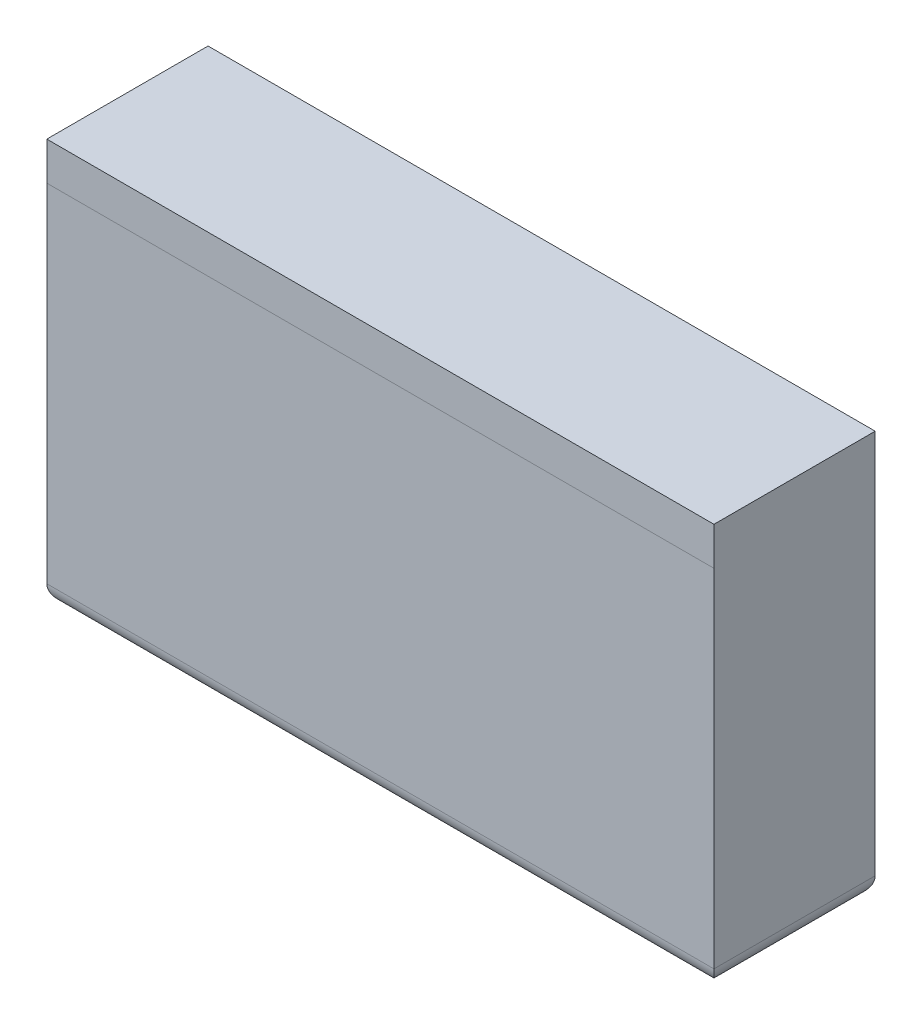
ISO-10303-21;
HEADER;
FILE_DESCRIPTION(('STEP AP214'),'2;1');
FILE_NAME('part.step','',(''),(''),'','','');
FILE_SCHEMA(('AUTOMOTIVE_DESIGN { 1 0 10303 214 1 1 1 1 }'));
ENDSEC;
DATA;
#1=APPLICATION_CONTEXT('core data for automotive mechanical design processes');
#2=APPLICATION_PROTOCOL_DEFINITION('international standard','automotive_design',2000,#1);
#3=PRODUCT_CONTEXT('',#1,'mechanical');
#4=PRODUCT('Part','Part','',(#3));
#5=PRODUCT_RELATED_PRODUCT_CATEGORY('part','',(#4));
#6=PRODUCT_DEFINITION_FORMATION('','',#4);
#7=PRODUCT_DEFINITION_CONTEXT('part definition',#1,'design');
#8=PRODUCT_DEFINITION('design','',#6,#7);
#9=PRODUCT_DEFINITION_SHAPE('','',#8);
#10=(LENGTH_UNIT() NAMED_UNIT(*) SI_UNIT(.MILLI.,.METRE.));
#11=(NAMED_UNIT(*) PLANE_ANGLE_UNIT() SI_UNIT($,.RADIAN.));
#12=(NAMED_UNIT(*) SI_UNIT($,.STERADIAN.) SOLID_ANGLE_UNIT());
#13=UNCERTAINTY_MEASURE_WITH_UNIT(LENGTH_MEASURE(1.E-05),#10,'distance_accuracy_value','');
#14=(GEOMETRIC_REPRESENTATION_CONTEXT(3) GLOBAL_UNCERTAINTY_ASSIGNED_CONTEXT((#13)) GLOBAL_UNIT_ASSIGNED_CONTEXT((#10,
#11,#12)) REPRESENTATION_CONTEXT('',''));
#15=CARTESIAN_POINT('',(0.,0.,0.));
#16=DIRECTION('',(0.,0.,1.));
#17=DIRECTION('',(1.,0.,0.));
#18=AXIS2_PLACEMENT_3D('',#15,#16,#17);
#19=CARTESIAN_POINT('',(122.822931560593,4.,0.));
#20=DIRECTION('',(-1.,0.,0.));
#21=DIRECTION('',(0.,0.,1.));
#22=AXIS2_PLACEMENT_3D('',#19,#20,#21);
#23=PLANE('',#22);
#24=DIRECTION('',(0.,-1.,0.));
#25=VECTOR('',#24,1.);
#26=CARTESIAN_POINT('',(122.822931560593,4.,21.15));
#27=LINE('',#26,#25);
#28=CARTESIAN_POINT('',(122.822931560593,96.,21.1493274629521));
#29=VERTEX_POINT('',#28);
#30=CARTESIAN_POINT('',(122.822931560593,5.,21.15));
#31=VERTEX_POINT('',#30);
#32=EDGE_CURVE('E328',#29,#31,#27,.T.);
#33=ORIENTED_EDGE('',*,*,#32,.T.);
#34=DIRECTION('',(0.,0.,-1.));
#35=VECTOR('',#34,1.);
#36=CARTESIAN_POINT('',(122.822931560593,5.,0.));
#37=LINE('',#36,#35);
#38=CARTESIAN_POINT('',(122.822931560593,5.,-21.15));
#39=VERTEX_POINT('',#38);
#40=EDGE_CURVE('E12',#31,#39,#37,.T.);
#41=ORIENTED_EDGE('',*,*,#40,.T.);
#42=DIRECTION('',(0.,-1.,0.));
#43=VECTOR('',#42,1.);
#44=CARTESIAN_POINT('',(122.822931560593,4.,-21.15));
#45=LINE('',#44,#43);
#46=CARTESIAN_POINT('',(122.822931560593,96.,-21.1493274629521));
#47=VERTEX_POINT('',#46);
#48=EDGE_CURVE('E175',#47,#39,#45,.T.);
#49=ORIENTED_EDGE('',*,*,#48,.F.);
#50=DIRECTION('',(0.,-1.,0.));
#51=VECTOR('',#50,1.);
#52=CARTESIAN_POINT('',(122.822931560593,106.,-21.1486549259042));
#53=LINE('',#52,#51);
#54=CARTESIAN_POINT('',(122.822931560593,106.,-21.1486549259042));
#55=VERTEX_POINT('',#54);
#56=EDGE_CURVE('E170',#55,#47,#53,.T.);
#57=ORIENTED_EDGE('',*,*,#56,.F.);
#58=DIRECTION('',(0.,0.,1.));
#59=VECTOR('',#58,1.);
#60=CARTESIAN_POINT('',(122.822931560593,106.,-21.1486549259042));
#61=LINE('',#60,#59);
#62=CARTESIAN_POINT('',(122.822931560593,106.,21.1486549259042));
#63=VERTEX_POINT('',#62);
#64=EDGE_CURVE('E173',#55,#63,#61,.T.);
#65=ORIENTED_EDGE('',*,*,#64,.T.);
#66=DIRECTION('',(0.,-1.,0.));
#67=VECTOR('',#66,1.);
#68=CARTESIAN_POINT('',(122.822931560593,106.,21.1486549259042));
#69=LINE('',#68,#67);
#70=EDGE_CURVE('E179',#63,#29,#69,.T.);
#71=ORIENTED_EDGE('',*,*,#70,.T.);
#72=EDGE_LOOP('',(#33,#41,#49,#57,#65,#71));
#73=FACE_BOUND('',#72,.T.);
#74=ADVANCED_FACE('F54',(#73),#23,.F.);
#75=CARTESIAN_POINT('',(0.,4.,-21.15));
#76=DIRECTION('',(0.,0.,-1.));
#77=DIRECTION('',(-1.,0.,0.));
#78=AXIS2_PLACEMENT_3D('',#75,#76,#77);
#79=PLANE('',#78);
#80=DIRECTION('',(0.,-1.,0.));
#81=VECTOR('',#80,1.);
#82=CARTESIAN_POINT('',(74.6879315605929,16.03,-21.15));
#83=LINE('',#82,#81);
#84=CARTESIAN_POINT('',(74.6879315605929,16.03,-21.15));
#85=VERTEX_POINT('',#84);
#86=CARTESIAN_POINT('',(74.6879315605929,5.,-21.15));
#87=VERTEX_POINT('',#86);
#88=EDGE_CURVE('E81',#85,#87,#83,.T.);
#89=ORIENTED_EDGE('',*,*,#88,.F.);
#90=DIRECTION('',(1.,0.,0.));
#91=VECTOR('',#90,1.);
#92=CARTESIAN_POINT('',(-4.04206843940716,16.03,-21.15));
#93=LINE('',#92,#91);
#94=CARTESIAN_POINT('',(-4.04206843940716,16.03,-21.15));
#95=VERTEX_POINT('',#94);
#96=EDGE_CURVE('E276',#95,#85,#93,.T.);
#97=ORIENTED_EDGE('',*,*,#96,.F.);
#98=DIRECTION('',(0.,1.,0.));
#99=VECTOR('',#98,1.);
#100=CARTESIAN_POINT('',(-4.04206843940716,16.03,-21.15));
#101=LINE('',#100,#99);
#102=CARTESIAN_POINT('',(-4.04206843940716,5.,-21.15));
#103=VERTEX_POINT('',#102);
#104=EDGE_CURVE('E273',#103,#95,#101,.T.);
#105=ORIENTED_EDGE('',*,*,#104,.F.);
#106=DIRECTION('',(1.,0.,0.));
#107=VECTOR('',#106,1.);
#108=CARTESIAN_POINT('',(-52.1770684394071,5.,-21.15));
#109=LINE('',#108,#107);
#110=CARTESIAN_POINT('',(-52.1770684394071,5.,-21.15));
#111=VERTEX_POINT('',#110);
#112=EDGE_CURVE('E349',#103,#111,#109,.F.);
#113=ORIENTED_EDGE('',*,*,#112,.T.);
#114=DIRECTION('',(0.,-1.,0.));
#115=VECTOR('',#114,1.);
#116=CARTESIAN_POINT('',(-52.1770684394071,4.,-21.15));
#117=LINE('',#116,#115);
#118=CARTESIAN_POINT('',(-52.1763959023592,96.,-21.1493274629521));
#119=VERTEX_POINT('',#118);
#120=EDGE_CURVE('E418',#119,#111,#117,.T.);
#121=ORIENTED_EDGE('',*,*,#120,.F.);
#122=CARTESIAN_POINT('',(-52.1770684394071,96.,-21.15));
#123=DIRECTION('',(1.,0.,0.));
#124=VECTOR('',#123,1.);
#125=LINE('',#122,#124);
#126=EDGE_CURVE('E433',#119,#47,#125,.T.);
#127=ORIENTED_EDGE('',*,*,#126,.T.);
#128=ORIENTED_EDGE('',*,*,#48,.T.);
#129=EDGE_CURVE('E65',#39,#87,#109,.F.);
#130=ORIENTED_EDGE('',*,*,#129,.T.);
#131=EDGE_LOOP('',(#89,#97,#105,#113,#121,#127,#128,#130));
#132=FACE_BOUND('',#131,.T.);
#133=ADVANCED_FACE('F398',(#132),#79,.T.);
#134=CARTESIAN_POINT('',(-52.1770684394071,4.,0.));
#135=DIRECTION('',(-1.,0.,0.));
#136=DIRECTION('',(0.,0.,1.));
#137=AXIS2_PLACEMENT_3D('',#134,#135,#136);
#138=PLANE('',#137);
#139=ORIENTED_EDGE('',*,*,#120,.T.);
#140=DIRECTION('',(0.,0.,-1.));
#141=VECTOR('',#140,1.);
#142=CARTESIAN_POINT('',(-52.1770684394071,5.,21.15));
#143=LINE('',#142,#141);
#144=CARTESIAN_POINT('',(-52.1770684394071,5.,21.15));
#145=VERTEX_POINT('',#144);
#146=EDGE_CURVE('E347',#111,#145,#143,.F.);
#147=ORIENTED_EDGE('',*,*,#146,.T.);
#148=DIRECTION('',(0.,-1.,0.));
#149=VECTOR('',#148,1.);
#150=CARTESIAN_POINT('',(-52.1770684394071,4.,21.15));
#151=LINE('',#150,#149);
#152=CARTESIAN_POINT('',(-52.1763959023592,96.,21.1493274629521));
#153=VERTEX_POINT('',#152);
#154=EDGE_CURVE('E323',#153,#145,#151,.T.);
#155=ORIENTED_EDGE('',*,*,#154,.F.);
#156=CARTESIAN_POINT('',(-52.1770684394071,96.,21.15));
#157=DIRECTION('',(0.,0.,-1.));
#158=VECTOR('',#157,1.);
#159=LINE('',#156,#158);
#160=EDGE_CURVE('E251',#153,#119,#159,.T.);
#161=ORIENTED_EDGE('',*,*,#160,.T.);
#162=EDGE_LOOP('',(#139,#147,#155,#161));
#163=FACE_BOUND('',#162,.T.);
#164=ADVANCED_FACE('F379',(#163),#138,.T.);
#165=CARTESIAN_POINT('',(0.,4.,21.15));
#166=DIRECTION('',(0.,0.,-1.));
#167=DIRECTION('',(-1.,0.,0.));
#168=AXIS2_PLACEMENT_3D('',#165,#166,#167);
#169=PLANE('',#168);
#170=ORIENTED_EDGE('',*,*,#154,.T.);
#171=DIRECTION('',(1.,0.,0.));
#172=VECTOR('',#171,1.);
#173=CARTESIAN_POINT('',(0.,5.,21.15));
#174=LINE('',#173,#172);
#175=EDGE_CURVE('E335',#145,#31,#174,.T.);
#176=ORIENTED_EDGE('',*,*,#175,.T.);
#177=ORIENTED_EDGE('',*,*,#32,.F.);
#178=CARTESIAN_POINT('',(-52.1757233653114,96.,21.1486549259042));
#179=DIRECTION('',(1.,0.,0.));
#180=VECTOR('',#179,1.);
#181=LINE('',#178,#180);
#182=EDGE_CURVE('E203',#153,#29,#181,.T.);
#183=ORIENTED_EDGE('',*,*,#182,.F.);
#184=EDGE_LOOP('',(#170,#176,#177,#183));
#185=FACE_BOUND('',#184,.T.);
#186=ADVANCED_FACE('F368',(#185),#169,.F.);
#187=CARTESIAN_POINT('',(0.,0.,0.));
#188=DIRECTION('',(0.,1.,0.));
#189=DIRECTION('',(0.,0.,1.));
#190=AXIS2_PLACEMENT_3D('',#187,#188,#189);
#191=PLANE('',#190);
#192=DIRECTION('',(0.,0.,-1.));
#193=VECTOR('',#192,1.);
#194=CARTESIAN_POINT('',(117.822931560593,0.,0.));
#195=LINE('',#194,#193);
#196=CARTESIAN_POINT('',(117.822931560593,0.,-16.15));
#197=VERTEX_POINT('',#196);
#198=CARTESIAN_POINT('',(117.822931560593,0.,16.15));
#199=VERTEX_POINT('',#198);
#200=EDGE_CURVE('E338',#197,#199,#195,.F.);
#201=ORIENTED_EDGE('',*,*,#200,.T.);
#202=DIRECTION('',(1.,0.,0.));
#203=VECTOR('',#202,1.);
#204=CARTESIAN_POINT('',(0.,0.,16.15));
#205=LINE('',#204,#203);
#206=CARTESIAN_POINT('',(-47.1770684394071,0.,16.15));
#207=VERTEX_POINT('',#206);
#208=EDGE_CURVE('E344',#199,#207,#205,.F.);
#209=ORIENTED_EDGE('',*,*,#208,.T.);
#210=DIRECTION('',(0.,0.,-1.));
#211=VECTOR('',#210,1.);
#212=CARTESIAN_POINT('',(-47.1770684394071,0.,-21.15));
#213=LINE('',#212,#211);
#214=CARTESIAN_POINT('',(-47.1770684394071,0.,-16.15));
#215=VERTEX_POINT('',#214);
#216=EDGE_CURVE('E342',#207,#215,#213,.T.);
#217=ORIENTED_EDGE('',*,*,#216,.T.);
#218=DIRECTION('',(1.,0.,0.));
#219=VECTOR('',#218,1.);
#220=CARTESIAN_POINT('',(122.822931560593,0.,-16.15));
#221=LINE('',#220,#219);
#222=EDGE_CURVE('E340',#215,#197,#221,.T.);
#223=ORIENTED_EDGE('',*,*,#222,.T.);
#224=EDGE_LOOP('',(#201,#209,#217,#223));
#225=FACE_BOUND('',#224,.T.);
#226=CARTESIAN_POINT('',(102.822931560593,0.,0.));
#227=DIRECTION('',(0.,1.,0.));
#228=DIRECTION('',(0.,0.,1.));
#229=AXIS2_PLACEMENT_3D('',#226,#227,#228);
#230=CIRCLE('',#229,5.);
#231=CARTESIAN_POINT('',(102.822931560593,0.,5.));
#232=VERTEX_POINT('',#231);
#233=EDGE_CURVE('E288',#232,#232,#230,.T.);
#234=ORIENTED_EDGE('',*,*,#233,.T.);
#235=EDGE_LOOP('',(#234));
#236=FACE_BOUND('',#235,.T.);
#237=CARTESIAN_POINT('',(-32.1770684394071,0.,0.));
#238=DIRECTION('',(0.,1.,0.));
#239=DIRECTION('',(0.,0.,1.));
#240=AXIS2_PLACEMENT_3D('',#237,#238,#239);
#241=CIRCLE('',#240,5.);
#242=CARTESIAN_POINT('',(-32.1770684394071,0.,5.));
#243=VERTEX_POINT('',#242);
#244=EDGE_CURVE('E291',#243,#243,#241,.T.);
#245=ORIENTED_EDGE('',*,*,#244,.T.);
#246=EDGE_LOOP('',(#245));
#247=FACE_BOUND('',#246,.T.);
#248=ADVANCED_FACE('F378',(#225,#236,#247),#191,.F.);
#249=CARTESIAN_POINT('',(0.,96.,17.15));
#250=DIRECTION('',(0.,0.,-1.));
#251=DIRECTION('',(-1.,0.,0.));
#252=AXIS2_PLACEMENT_3D('',#249,#250,#251);
#253=PLANE('',#252);
#254=DIRECTION('',(0.,-1.,0.));
#255=VECTOR('',#254,1.);
#256=CARTESIAN_POINT('',(118.822931560593,96.,17.15));
#257=LINE('',#256,#255);
#258=CARTESIAN_POINT('',(118.822931560593,96.,17.15));
#259=VERTEX_POINT('',#258);
#260=CARTESIAN_POINT('',(118.822931560593,4.,17.15));
#261=VERTEX_POINT('',#260);
#262=EDGE_CURVE('E311',#259,#261,#257,.T.);
#263=ORIENTED_EDGE('',*,*,#262,.T.);
#264=DIRECTION('',(-1.,0.,0.));
#265=VECTOR('',#264,1.);
#266=CARTESIAN_POINT('',(0.,4.,17.15));
#267=LINE('',#266,#265);
#268=CARTESIAN_POINT('',(-48.1770684394071,4.,17.15));
#269=VERTEX_POINT('',#268);
#270=EDGE_CURVE('E332',#261,#269,#267,.T.);
#271=ORIENTED_EDGE('',*,*,#270,.T.);
#272=DIRECTION('',(0.,-1.,0.));
#273=VECTOR('',#272,1.);
#274=CARTESIAN_POINT('',(-48.1770684394071,96.,17.15));
#275=LINE('',#274,#273);
#276=CARTESIAN_POINT('',(-48.1770684394071,96.,17.15));
#277=VERTEX_POINT('',#276);
#278=EDGE_CURVE('E320',#277,#269,#275,.T.);
#279=ORIENTED_EDGE('',*,*,#278,.F.);
#280=DIRECTION('',(1.,0.,0.));
#281=VECTOR('',#280,1.);
#282=CARTESIAN_POINT('',(0.,96.,17.15));
#283=LINE('',#282,#281);
#284=EDGE_CURVE('E301',#277,#259,#283,.T.);
#285=ORIENTED_EDGE('',*,*,#284,.T.);
#286=EDGE_LOOP('',(#263,#271,#279,#285));
#287=FACE_BOUND('',#286,.T.);
#288=ADVANCED_FACE('F482',(#287),#253,.T.);
#289=CARTESIAN_POINT('',(-48.1770684394071,96.,0.));
#290=DIRECTION('',(-1.,0.,0.));
#291=DIRECTION('',(0.,0.,1.));
#292=AXIS2_PLACEMENT_3D('',#289,#290,#291);
#293=PLANE('',#292);
#294=DIRECTION('',(0.,0.,1.));
#295=VECTOR('',#294,1.);
#296=CARTESIAN_POINT('',(-48.1770684394071,4.,0.));
#297=LINE('',#296,#295);
#298=CARTESIAN_POINT('',(-48.1770684394071,4.,-17.15));
#299=VERTEX_POINT('',#298);
#300=EDGE_CURVE('E330',#299,#269,#297,.T.);
#301=ORIENTED_EDGE('',*,*,#300,.F.);
#302=DIRECTION('',(0.,-1.,0.));
#303=VECTOR('',#302,1.);
#304=CARTESIAN_POINT('',(-48.1770684394071,96.,-17.15));
#305=LINE('',#304,#303);
#306=CARTESIAN_POINT('',(-48.1770684394071,96.,-17.15));
#307=VERTEX_POINT('',#306);
#308=EDGE_CURVE('E317',#307,#299,#305,.T.);
#309=ORIENTED_EDGE('',*,*,#308,.F.);
#310=DIRECTION('',(0.,0.,-1.));
#311=VECTOR('',#310,1.);
#312=CARTESIAN_POINT('',(-48.1770684394071,96.,0.));
#313=LINE('',#312,#311);
#314=EDGE_CURVE('E304',#277,#307,#313,.T.);
#315=ORIENTED_EDGE('',*,*,#314,.F.);
#316=ORIENTED_EDGE('',*,*,#278,.T.);
#317=EDGE_LOOP('',(#301,#309,#315,#316));
#318=FACE_BOUND('',#317,.T.);
#319=ADVANCED_FACE('F466',(#318),#293,.F.);
#320=CARTESIAN_POINT('',(0.,96.,-17.15));
#321=DIRECTION('',(0.,0.,-1.));
#322=DIRECTION('',(-1.,0.,0.));
#323=AXIS2_PLACEMENT_3D('',#320,#321,#322);
#324=PLANE('',#323);
#325=DIRECTION('',(0.,-1.,0.));
#326=VECTOR('',#325,1.);
#327=CARTESIAN_POINT('',(74.6879315605929,16.03,-17.15));
#328=LINE('',#327,#326);
#329=CARTESIAN_POINT('',(74.6879315605929,16.03,-17.15));
#330=VERTEX_POINT('',#329);
#331=CARTESIAN_POINT('',(74.6879315605929,5.,-17.15));
#332=VERTEX_POINT('',#331);
#333=EDGE_CURVE('E267',#330,#332,#328,.T.);
#334=ORIENTED_EDGE('',*,*,#333,.T.);
#335=DIRECTION('',(-1.,0.,0.));
#336=VECTOR('',#335,1.);
#337=CARTESIAN_POINT('',(74.6879315605929,5.,-17.15));
#338=LINE('',#337,#336);
#339=CARTESIAN_POINT('',(-4.04206843940716,5.,-17.15));
#340=VERTEX_POINT('',#339);
#341=EDGE_CURVE('E255',#332,#340,#338,.T.);
#342=ORIENTED_EDGE('',*,*,#341,.T.);
#343=DIRECTION('',(0.,1.,0.));
#344=VECTOR('',#343,1.);
#345=CARTESIAN_POINT('',(-4.04206843940716,16.03,-17.15));
#346=LINE('',#345,#344);
#347=CARTESIAN_POINT('',(-4.04206843940716,16.03,-17.15));
#348=VERTEX_POINT('',#347);
#349=EDGE_CURVE('E263',#340,#348,#346,.T.);
#350=ORIENTED_EDGE('',*,*,#349,.T.);
#351=DIRECTION('',(1.,0.,0.));
#352=VECTOR('',#351,1.);
#353=CARTESIAN_POINT('',(-4.04206843940716,16.03,-17.15));
#354=LINE('',#353,#352);
#355=EDGE_CURVE('E73',#348,#330,#354,.T.);
#356=ORIENTED_EDGE('',*,*,#355,.T.);
#357=EDGE_LOOP('',(#334,#342,#350,#356));
#358=FACE_BOUND('',#357,.T.);
#359=DIRECTION('',(-1.,0.,0.));
#360=VECTOR('',#359,1.);
#361=CARTESIAN_POINT('',(0.,4.,-17.15));
#362=LINE('',#361,#360);
#363=CARTESIAN_POINT('',(118.822931560593,4.,-17.15));
#364=VERTEX_POINT('',#363);
#365=EDGE_CURVE('E327',#364,#299,#362,.T.);
#366=ORIENTED_EDGE('',*,*,#365,.F.);
#367=DIRECTION('',(0.,-1.,0.));
#368=VECTOR('',#367,1.);
#369=CARTESIAN_POINT('',(118.822931560593,96.,-17.15));
#370=LINE('',#369,#368);
#371=CARTESIAN_POINT('',(118.822931560593,96.,-17.15));
#372=VERTEX_POINT('',#371);
#373=EDGE_CURVE('E314',#372,#364,#370,.T.);
#374=ORIENTED_EDGE('',*,*,#373,.F.);
#375=DIRECTION('',(1.,0.,0.));
#376=VECTOR('',#375,1.);
#377=CARTESIAN_POINT('',(0.,96.,-17.15));
#378=LINE('',#377,#376);
#379=EDGE_CURVE('E306',#307,#372,#378,.T.);
#380=ORIENTED_EDGE('',*,*,#379,.F.);
#381=ORIENTED_EDGE('',*,*,#308,.T.);
#382=EDGE_LOOP('',(#366,#374,#380,#381));
#383=FACE_BOUND('',#382,.T.);
#384=ADVANCED_FACE('F462',(#358,#383),#324,.F.);
#385=CARTESIAN_POINT('',(118.822931560593,96.,0.));
#386=DIRECTION('',(-1.,0.,0.));
#387=DIRECTION('',(0.,0.,1.));
#388=AXIS2_PLACEMENT_3D('',#385,#386,#387);
#389=PLANE('',#388);
#390=ORIENTED_EDGE('',*,*,#373,.T.);
#391=DIRECTION('',(0.,0.,1.));
#392=VECTOR('',#391,1.);
#393=CARTESIAN_POINT('',(118.822931560593,4.,0.));
#394=LINE('',#393,#392);
#395=EDGE_CURVE('E324',#364,#261,#394,.T.);
#396=ORIENTED_EDGE('',*,*,#395,.T.);
#397=ORIENTED_EDGE('',*,*,#262,.F.);
#398=DIRECTION('',(0.,0.,-1.));
#399=VECTOR('',#398,1.);
#400=CARTESIAN_POINT('',(118.822931560593,96.,0.));
#401=LINE('',#400,#399);
#402=EDGE_CURVE('E308',#259,#372,#401,.T.);
#403=ORIENTED_EDGE('',*,*,#402,.T.);
#404=EDGE_LOOP('',(#390,#396,#397,#403));
#405=FACE_BOUND('',#404,.T.);
#406=ADVANCED_FACE('F465',(#405),#389,.T.);
#407=CARTESIAN_POINT('',(0.,4.,0.));
#408=DIRECTION('',(0.,1.,0.));
#409=DIRECTION('',(0.,0.,1.));
#410=AXIS2_PLACEMENT_3D('',#407,#408,#409);
#411=PLANE('',#410);
#412=ORIENTED_EDGE('',*,*,#270,.F.);
#413=ORIENTED_EDGE('',*,*,#395,.F.);
#414=ORIENTED_EDGE('',*,*,#365,.T.);
#415=ORIENTED_EDGE('',*,*,#300,.T.);
#416=EDGE_LOOP('',(#412,#413,#414,#415));
#417=FACE_BOUND('',#416,.T.);
#418=ADVANCED_FACE('F480',(#417),#411,.T.);
#419=CARTESIAN_POINT('',(-32.1770684394071,-10.,0.));
#420=DIRECTION('',(0.,1.,0.));
#421=DIRECTION('',(0.,0.,1.));
#422=AXIS2_PLACEMENT_3D('',#419,#420,#421);
#423=CYLINDRICAL_SURFACE('',#422,5.);
#424=CARTESIAN_POINT('',(-32.1770684394071,-10.,0.));
#425=DIRECTION('',(0.,1.,0.));
#426=DIRECTION('',(0.,0.,1.));
#427=AXIS2_PLACEMENT_3D('',#424,#425,#426);
#428=CIRCLE('',#427,5.);
#429=CARTESIAN_POINT('',(-32.1770684394071,-10.,5.));
#430=VERTEX_POINT('',#429);
#431=EDGE_CURVE('E296',#430,#430,#428,.T.);
#432=ORIENTED_EDGE('',*,*,#431,.T.);
#433=EDGE_LOOP('',(#432));
#434=FACE_BOUND('',#433,.T.);
#435=ORIENTED_EDGE('',*,*,#244,.F.);
#436=EDGE_LOOP('',(#435));
#437=FACE_BOUND('',#436,.T.);
#438=ADVANCED_FACE('F493',(#434,#437),#423,.T.);
#439=CARTESIAN_POINT('',(0.,-10.,0.));
#440=DIRECTION('',(0.,1.,0.));
#441=DIRECTION('',(0.,0.,1.));
#442=AXIS2_PLACEMENT_3D('',#439,#440,#441);
#443=PLANE('',#442);
#444=ORIENTED_EDGE('',*,*,#431,.F.);
#445=EDGE_LOOP('',(#444));
#446=FACE_BOUND('',#445,.T.);
#447=ADVANCED_FACE('F498',(#446),#443,.F.);
#448=CARTESIAN_POINT('',(102.822931560593,-10.,0.));
#449=DIRECTION('',(0.,1.,0.));
#450=DIRECTION('',(0.,0.,1.));
#451=AXIS2_PLACEMENT_3D('',#448,#449,#450);
#452=CYLINDRICAL_SURFACE('',#451,5.);
#453=CARTESIAN_POINT('',(102.822931560593,-10.,0.));
#454=DIRECTION('',(0.,1.,0.));
#455=DIRECTION('',(0.,0.,1.));
#456=AXIS2_PLACEMENT_3D('',#453,#454,#455);
#457=CIRCLE('',#456,5.);
#458=CARTESIAN_POINT('',(102.822931560593,-10.,5.));
#459=VERTEX_POINT('',#458);
#460=EDGE_CURVE('E292',#459,#459,#457,.T.);
#461=ORIENTED_EDGE('',*,*,#460,.T.);
#462=EDGE_LOOP('',(#461));
#463=FACE_BOUND('',#462,.T.);
#464=ORIENTED_EDGE('',*,*,#233,.F.);
#465=EDGE_LOOP('',(#464));
#466=FACE_BOUND('',#465,.T.);
#467=ADVANCED_FACE('F508',(#463,#466),#452,.T.);
#468=CARTESIAN_POINT('',(102.822931560593,-10.,0.));
#469=DIRECTION('',(0.,1.,0.));
#470=DIRECTION('',(0.,0.,1.));
#471=AXIS2_PLACEMENT_3D('',#468,#469,#470);
#472=PLANE('',#471);
#473=ORIENTED_EDGE('',*,*,#460,.F.);
#474=EDGE_LOOP('',(#473));
#475=FACE_BOUND('',#474,.T.);
#476=ADVANCED_FACE('F395',(#475),#472,.F.);
#477=CARTESIAN_POINT('',(0.,5.,-16.15));
#478=DIRECTION('',(-1.,0.,0.));
#479=DIRECTION('',(0.,0.,1.));
#480=AXIS2_PLACEMENT_3D('',#477,#478,#479);
#481=CYLINDRICAL_SURFACE('',#480,5.);
#482=CARTESIAN_POINT('',(117.822931560593,5.,-16.15));
#483=DIRECTION('',(-0.707106781186548,0.,-0.707106781186547));
#484=DIRECTION('',(0.707106781186547,0.,-0.707106781186547));
#485=AXIS2_PLACEMENT_3D('',#482,#483,#484);
#486=ELLIPSE('',#485,7.07106781186548,5.);
#487=EDGE_CURVE('E355',#197,#39,#486,.F.);
#488=ORIENTED_EDGE('',*,*,#487,.F.);
#489=ORIENTED_EDGE('',*,*,#222,.F.);
#490=CARTESIAN_POINT('',(-47.1770684394071,5.,-16.15));
#491=DIRECTION('',(-0.707106781186547,0.,0.707106781186547));
#492=DIRECTION('',(-0.707106781186548,0.,-0.707106781186547));
#493=AXIS2_PLACEMENT_3D('',#490,#491,#492);
#494=ELLIPSE('',#493,7.07106781186547,5.);
#495=EDGE_CURVE('E295',#111,#215,#494,.T.);
#496=ORIENTED_EDGE('',*,*,#495,.F.);
#497=ORIENTED_EDGE('',*,*,#112,.F.);
#498=DIRECTION('',(-1.,0.,0.));
#499=VECTOR('',#498,1.);
#500=CARTESIAN_POINT('',(74.6879315605929,5.,-21.15));
#501=LINE('',#500,#499);
#502=EDGE_CURVE('E242',#87,#103,#501,.T.);
#503=ORIENTED_EDGE('',*,*,#502,.F.);
#504=ORIENTED_EDGE('',*,*,#129,.F.);
#505=EDGE_LOOP('',(#488,#489,#496,#497,#503,#504));
#506=FACE_BOUND('',#505,.T.);
#507=ADVANCED_FACE('F56',(#506),#481,.T.);
#508=CARTESIAN_POINT('',(-47.1770684394071,5.,0.));
#509=DIRECTION('',(0.,0.,1.));
#510=DIRECTION('',(1.,0.,0.));
#511=AXIS2_PLACEMENT_3D('',#508,#509,#510);
#512=CYLINDRICAL_SURFACE('',#511,5.);
#513=ORIENTED_EDGE('',*,*,#495,.T.);
#514=ORIENTED_EDGE('',*,*,#216,.F.);
#515=CARTESIAN_POINT('',(-47.1770684394071,5.,16.15));
#516=DIRECTION('',(0.707106781186548,0.,0.707106781186547));
#517=DIRECTION('',(-0.707106781186547,0.,0.707106781186547));
#518=AXIS2_PLACEMENT_3D('',#515,#516,#517);
#519=ELLIPSE('',#518,7.07106781186548,5.);
#520=EDGE_CURVE('E353',#145,#207,#519,.T.);
#521=ORIENTED_EDGE('',*,*,#520,.F.);
#522=ORIENTED_EDGE('',*,*,#146,.F.);
#523=EDGE_LOOP('',(#513,#514,#521,#522));
#524=FACE_BOUND('',#523,.T.);
#525=ADVANCED_FACE('F388',(#524),#512,.T.);
#526=CARTESIAN_POINT('',(117.822931560593,5.,0.));
#527=DIRECTION('',(0.,0.,-1.));
#528=DIRECTION('',(-1.,0.,0.));
#529=AXIS2_PLACEMENT_3D('',#526,#527,#528);
#530=CYLINDRICAL_SURFACE('',#529,5.);
#531=ORIENTED_EDGE('',*,*,#487,.T.);
#532=ORIENTED_EDGE('',*,*,#40,.F.);
#533=CARTESIAN_POINT('',(117.822931560593,5.,16.15));
#534=DIRECTION('',(0.707106781186547,0.,-0.707106781186547));
#535=DIRECTION('',(-0.707106781186548,0.,-0.707106781186547));
#536=AXIS2_PLACEMENT_3D('',#533,#534,#535);
#537=ELLIPSE('',#536,7.07106781186547,5.);
#538=EDGE_CURVE('E282',#199,#31,#537,.F.);
#539=ORIENTED_EDGE('',*,*,#538,.F.);
#540=ORIENTED_EDGE('',*,*,#200,.F.);
#541=EDGE_LOOP('',(#531,#532,#539,#540));
#542=FACE_BOUND('',#541,.T.);
#543=ADVANCED_FACE('F385',(#542),#530,.T.);
#544=CARTESIAN_POINT('',(0.,5.,16.15));
#545=DIRECTION('',(1.,0.,0.));
#546=DIRECTION('',(0.,0.,-1.));
#547=AXIS2_PLACEMENT_3D('',#544,#545,#546);
#548=CYLINDRICAL_SURFACE('',#547,5.);
#549=ORIENTED_EDGE('',*,*,#520,.T.);
#550=ORIENTED_EDGE('',*,*,#208,.F.);
#551=ORIENTED_EDGE('',*,*,#538,.T.);
#552=ORIENTED_EDGE('',*,*,#175,.F.);
#553=EDGE_LOOP('',(#549,#550,#551,#552));
#554=FACE_BOUND('',#553,.T.);
#555=ADVANCED_FACE('F381',(#554),#548,.T.);
#556=CARTESIAN_POINT('',(74.6879315605929,5.,-17.15));
#557=DIRECTION('',(0.,-1.,0.));
#558=DIRECTION('',(0.,0.,-1.));
#559=AXIS2_PLACEMENT_3D('',#556,#557,#558);
#560=PLANE('',#559);
#561=ORIENTED_EDGE('',*,*,#502,.T.);
#562=DIRECTION('',(0.,0.,-1.));
#563=VECTOR('',#562,1.);
#564=CARTESIAN_POINT('',(-4.04206843940716,5.,-17.15));
#565=LINE('',#564,#563);
#566=EDGE_CURVE('E270',#340,#103,#565,.T.);
#567=ORIENTED_EDGE('',*,*,#566,.F.);
#568=ORIENTED_EDGE('',*,*,#341,.F.);
#569=DIRECTION('',(0.,0.,-1.));
#570=VECTOR('',#569,1.);
#571=CARTESIAN_POINT('',(74.6879315605929,5.,-17.15));
#572=LINE('',#571,#570);
#573=EDGE_CURVE('E280',#332,#87,#572,.T.);
#574=ORIENTED_EDGE('',*,*,#573,.T.);
#575=EDGE_LOOP('',(#561,#567,#568,#574));
#576=FACE_BOUND('',#575,.T.);
#577=ADVANCED_FACE('F384',(#576),#560,.F.);
#578=CARTESIAN_POINT('',(74.6879315605929,16.03,-17.15));
#579=DIRECTION('',(1.,0.,0.));
#580=DIRECTION('',(0.,0.,-1.));
#581=AXIS2_PLACEMENT_3D('',#578,#579,#580);
#582=PLANE('',#581);
#583=ORIENTED_EDGE('',*,*,#88,.T.);
#584=ORIENTED_EDGE('',*,*,#573,.F.);
#585=ORIENTED_EDGE('',*,*,#333,.F.);
#586=DIRECTION('',(0.,0.,-1.));
#587=VECTOR('',#586,1.);
#588=CARTESIAN_POINT('',(74.6879315605929,16.03,-17.15));
#589=LINE('',#588,#587);
#590=EDGE_CURVE('E283',#330,#85,#589,.T.);
#591=ORIENTED_EDGE('',*,*,#590,.T.);
#592=EDGE_LOOP('',(#583,#584,#585,#591));
#593=FACE_BOUND('',#592,.T.);
#594=ADVANCED_FACE('F228',(#593),#582,.F.);
#595=CARTESIAN_POINT('',(-4.04206843940716,16.03,-17.15));
#596=DIRECTION('',(0.,1.,0.));
#597=DIRECTION('',(0.,0.,1.));
#598=AXIS2_PLACEMENT_3D('',#595,#596,#597);
#599=PLANE('',#598);
#600=ORIENTED_EDGE('',*,*,#96,.T.);
#601=ORIENTED_EDGE('',*,*,#590,.F.);
#602=ORIENTED_EDGE('',*,*,#355,.F.);
#603=DIRECTION('',(0.,0.,-1.));
#604=VECTOR('',#603,1.);
#605=CARTESIAN_POINT('',(-4.04206843940716,16.03,-17.15));
#606=LINE('',#605,#604);
#607=EDGE_CURVE('E285',#348,#95,#606,.T.);
#608=ORIENTED_EDGE('',*,*,#607,.T.);
#609=EDGE_LOOP('',(#600,#601,#602,#608));
#610=FACE_BOUND('',#609,.T.);
#611=ADVANCED_FACE('F454',(#610),#599,.F.);
#612=CARTESIAN_POINT('',(-4.04206843940716,16.03,-17.15));
#613=DIRECTION('',(-1.,0.,0.));
#614=DIRECTION('',(0.,0.,1.));
#615=AXIS2_PLACEMENT_3D('',#612,#613,#614);
#616=PLANE('',#615);
#617=ORIENTED_EDGE('',*,*,#104,.T.);
#618=ORIENTED_EDGE('',*,*,#607,.F.);
#619=ORIENTED_EDGE('',*,*,#349,.F.);
#620=ORIENTED_EDGE('',*,*,#566,.T.);
#621=EDGE_LOOP('',(#617,#618,#619,#620));
#622=FACE_BOUND('',#621,.T.);
#623=ADVANCED_FACE('F458',(#622),#616,.F.);
#624=CARTESIAN_POINT('',(0.,96.,0.));
#625=DIRECTION('',(0.,-1.,0.));
#626=DIRECTION('',(0.,0.,-1.));
#627=AXIS2_PLACEMENT_3D('',#624,#625,#626);
#628=PLANE('',#627);
#629=ORIENTED_EDGE('',*,*,#284,.F.);
#630=ORIENTED_EDGE('',*,*,#314,.T.);
#631=ORIENTED_EDGE('',*,*,#379,.T.);
#632=ORIENTED_EDGE('',*,*,#402,.F.);
#633=EDGE_LOOP('',(#629,#630,#631,#632));
#634=FACE_BOUND('',#633,.T.);
#635=ADVANCED_FACE('F227',(#634),#628,.T.);
#636=CARTESIAN_POINT('',(-52.1757233653114,106.,-21.1486549259042));
#637=DIRECTION('',(0.,0.,-1.));
#638=DIRECTION('',(-1.,0.,0.));
#639=AXIS2_PLACEMENT_3D('',#636,#637,#638);
#640=PLANE('',#639);
#641=ORIENTED_EDGE('',*,*,#126,.F.);
#642=DIRECTION('',(0.,-1.,0.));
#643=VECTOR('',#642,1.);
#644=CARTESIAN_POINT('',(-52.1757233653114,106.,-21.1486549259042));
#645=LINE('',#644,#643);
#646=CARTESIAN_POINT('',(-52.1757233653114,106.,-21.1486549259042));
#647=VERTEX_POINT('',#646);
#648=EDGE_CURVE('E192',#647,#119,#645,.T.);
#649=ORIENTED_EDGE('',*,*,#648,.F.);
#650=DIRECTION('',(1.,0.,0.));
#651=VECTOR('',#650,1.);
#652=CARTESIAN_POINT('',(-52.1757233653114,106.,-21.1486549259042));
#653=LINE('',#652,#651);
#654=EDGE_CURVE('E185',#647,#55,#653,.T.);
#655=ORIENTED_EDGE('',*,*,#654,.T.);
#656=ORIENTED_EDGE('',*,*,#56,.T.);
#657=EDGE_LOOP('',(#641,#649,#655,#656));
#658=FACE_BOUND('',#657,.T.);
#659=ADVANCED_FACE('F190',(#658),#640,.T.);
#660=CARTESIAN_POINT('',(-52.1757233653114,106.,-21.1486549259042));
#661=DIRECTION('',(1.,0.,0.));
#662=DIRECTION('',(0.,0.,-1.));
#663=AXIS2_PLACEMENT_3D('',#660,#661,#662);
#664=PLANE('',#663);
#665=ORIENTED_EDGE('',*,*,#160,.F.);
#666=DIRECTION('',(0.,-1.,0.));
#667=VECTOR('',#666,1.);
#668=CARTESIAN_POINT('',(-52.1757233653114,106.,21.1486549259042));
#669=LINE('',#668,#667);
#670=CARTESIAN_POINT('',(-52.1757233653114,106.,21.1486549259042));
#671=VERTEX_POINT('',#670);
#672=EDGE_CURVE('E209',#671,#153,#669,.T.);
#673=ORIENTED_EDGE('',*,*,#672,.F.);
#674=DIRECTION('',(0.,0.,1.));
#675=VECTOR('',#674,1.);
#676=CARTESIAN_POINT('',(-52.1757233653114,106.,-21.1486549259042));
#677=LINE('',#676,#675);
#678=EDGE_CURVE('E180',#647,#671,#677,.T.);
#679=ORIENTED_EDGE('',*,*,#678,.F.);
#680=ORIENTED_EDGE('',*,*,#648,.T.);
#681=EDGE_LOOP('',(#665,#673,#679,#680));
#682=FACE_BOUND('',#681,.T.);
#683=ADVANCED_FACE('F221',(#682),#664,.F.);
#684=CARTESIAN_POINT('',(-52.1757233653114,106.,21.1486549259042));
#685=DIRECTION('',(0.,0.,-1.));
#686=DIRECTION('',(-1.,0.,0.));
#687=AXIS2_PLACEMENT_3D('',#684,#685,#686);
#688=PLANE('',#687);
#689=ORIENTED_EDGE('',*,*,#182,.T.);
#690=ORIENTED_EDGE('',*,*,#70,.F.);
#691=DIRECTION('',(1.,0.,0.));
#692=VECTOR('',#691,1.);
#693=CARTESIAN_POINT('',(-52.1757233653114,106.,21.1486549259042));
#694=LINE('',#693,#692);
#695=EDGE_CURVE('E187',#671,#63,#694,.T.);
#696=ORIENTED_EDGE('',*,*,#695,.F.);
#697=ORIENTED_EDGE('',*,*,#672,.T.);
#698=EDGE_LOOP('',(#689,#690,#696,#697));
#699=FACE_BOUND('',#698,.T.);
#700=ADVANCED_FACE('F211',(#699),#688,.F.);
#701=CARTESIAN_POINT('',(0.,106.,0.));
#702=DIRECTION('',(0.,-1.,0.));
#703=DIRECTION('',(0.,0.,-1.));
#704=AXIS2_PLACEMENT_3D('',#701,#702,#703);
#705=PLANE('',#704);
#706=ORIENTED_EDGE('',*,*,#654,.F.);
#707=ORIENTED_EDGE('',*,*,#678,.T.);
#708=ORIENTED_EDGE('',*,*,#695,.T.);
#709=ORIENTED_EDGE('',*,*,#64,.F.);
#710=EDGE_LOOP('',(#706,#707,#708,#709));
#711=FACE_BOUND('',#710,.T.);
#712=ADVANCED_FACE('F184',(#711),#705,.F.);
#713=CLOSED_SHELL('',(#74,#133,#164,#186,#248,#288,#319,#384,#406,#418,#438,#447,#467,#476,#507,
#525,#543,#555,#577,#594,#611,#623,#635,#659,#683,#700,#712));
#714=MANIFOLD_SOLID_BREP('B2',#713);
#715=ADVANCED_BREP_SHAPE_REPRESENTATION('',(#18,#714),#14);
#716=SHAPE_DEFINITION_REPRESENTATION(#9,#715);
ENDSEC;
END-ISO-10303-21;
